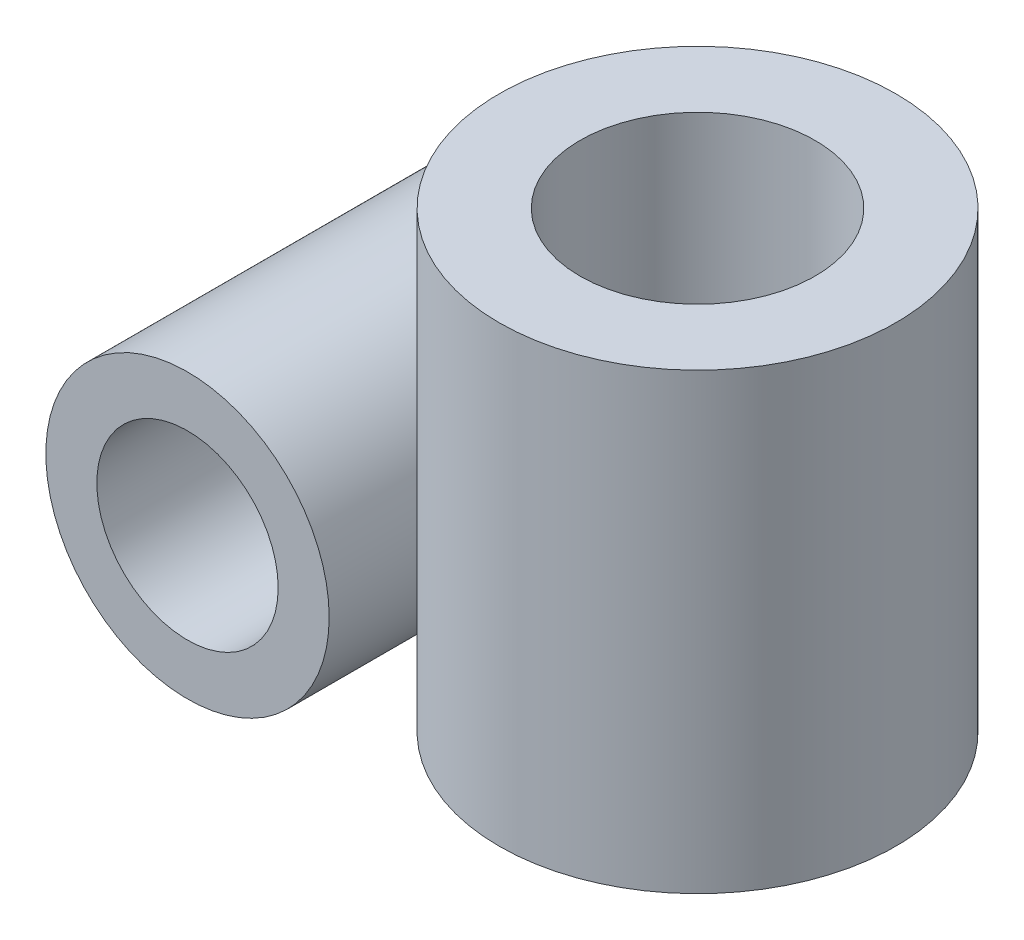
ISO-10303-21;
HEADER;
FILE_DESCRIPTION(('STEP AP214'),'2;1');
FILE_NAME('part.step','',(''),(''),'','','');
FILE_SCHEMA(('AUTOMOTIVE_DESIGN { 1 0 10303 214 1 1 1 1 }'));
ENDSEC;
DATA;
#1=APPLICATION_CONTEXT('core data for automotive mechanical design processes');
#2=APPLICATION_PROTOCOL_DEFINITION('international standard','automotive_design',2000,#1);
#3=PRODUCT_CONTEXT('',#1,'mechanical');
#4=PRODUCT('Part','Part','',(#3));
#5=PRODUCT_RELATED_PRODUCT_CATEGORY('part','',(#4));
#6=PRODUCT_DEFINITION_FORMATION('','',#4);
#7=PRODUCT_DEFINITION_CONTEXT('part definition',#1,'design');
#8=PRODUCT_DEFINITION('design','',#6,#7);
#9=PRODUCT_DEFINITION_SHAPE('','',#8);
#10=(LENGTH_UNIT() NAMED_UNIT(*) SI_UNIT(.MILLI.,.METRE.));
#11=(NAMED_UNIT(*) PLANE_ANGLE_UNIT() SI_UNIT($,.RADIAN.));
#12=(NAMED_UNIT(*) SI_UNIT($,.STERADIAN.) SOLID_ANGLE_UNIT());
#13=UNCERTAINTY_MEASURE_WITH_UNIT(LENGTH_MEASURE(1.E-05),#10,'distance_accuracy_value','');
#14=(GEOMETRIC_REPRESENTATION_CONTEXT(3) GLOBAL_UNCERTAINTY_ASSIGNED_CONTEXT((#13)) GLOBAL_UNIT_ASSIGNED_CONTEXT((#10,
#11,#12)) REPRESENTATION_CONTEXT('',''));
#15=CARTESIAN_POINT('',(0.,0.,0.));
#16=DIRECTION('',(0.,0.,1.));
#17=DIRECTION('',(1.,0.,0.));
#18=AXIS2_PLACEMENT_3D('',#15,#16,#17);
#19=CARTESIAN_POINT('',(0.,16.,0.));
#20=DIRECTION('',(0.,-1.,0.));
#21=DIRECTION('',(0.,0.,-1.));
#22=AXIS2_PLACEMENT_3D('',#19,#20,#21);
#23=CYLINDRICAL_SURFACE('',#22,7.);
#24=CARTESIAN_POINT('',(0.,0.,0.));
#25=DIRECTION('',(0.,1.,0.));
#26=DIRECTION('',(0.,0.,1.));
#27=AXIS2_PLACEMENT_3D('',#24,#25,#26);
#28=CIRCLE('',#27,7.);
#29=CARTESIAN_POINT('',(0.,0.,7.));
#30=VERTEX_POINT('',#29);
#31=EDGE_CURVE('E60',#30,#30,#28,.T.);
#32=ORIENTED_EDGE('',*,*,#31,.T.);
#33=EDGE_LOOP('',(#32));
#34=FACE_BOUND('',#33,.T.);
#35=CARTESIAN_POINT('',(0.,16.,0.));
#36=DIRECTION('',(0.,1.,0.));
#37=DIRECTION('',(0.,0.,1.));
#38=AXIS2_PLACEMENT_3D('',#35,#36,#37);
#39=CIRCLE('',#38,7.);
#40=CARTESIAN_POINT('',(0.,16.,7.));
#41=VERTEX_POINT('',#40);
#42=EDGE_CURVE('E55',#41,#41,#39,.T.);
#43=ORIENTED_EDGE('',*,*,#42,.F.);
#44=EDGE_LOOP('',(#43));
#45=FACE_BOUND('',#44,.T.);
#46=CARTESIAN_POINT('',(-7.,9.,0.));
#47=CARTESIAN_POINT('',(-7.00000021391944,8.99999958598632,-0.149513409221021));
#48=CARTESIAN_POINT('',(-6.99520473204957,8.99641683546412,-0.299022395938686));
#49=CARTESIAN_POINT('',(-6.97608420309327,8.98196914776317,-0.597127977276325));
#50=CARTESIAN_POINT('',(-6.96175620711012,8.97110195712475,-0.74572427519412));
#51=CARTESIAN_POINT('',(-6.92373154199772,8.94171928034641,-1.04123684317492));
#52=CARTESIAN_POINT('',(-6.90001761525997,8.92318970279629,-1.1881495026941));
#53=CARTESIAN_POINT('',(-6.84358438470612,8.87793099010202,-1.47894705862266));
#54=CARTESIAN_POINT('',(-6.81086591715694,8.85120261636751,-1.62283223486438));
#55=CARTESIAN_POINT('',(-6.73677250347208,8.78862919637888,-1.90725188021725));
#56=CARTESIAN_POINT('',(-6.69534970997811,8.75273351255337,-2.04776283504164));
#57=CARTESIAN_POINT('',(-6.60478129390443,8.67099570088918,-2.32333717281914));
#58=CARTESIAN_POINT('',(-6.55563485526222,8.62515252182606,-2.45839997823623));
#59=CARTESIAN_POINT('',(-6.45088906552741,8.52266479266894,-2.72140075078879));
#60=CARTESIAN_POINT('',(-6.39530372316844,8.466043525249,-2.84935332141885));
#61=CARTESIAN_POINT('',(-6.27913693932281,8.34102489054074,-3.09695258314991));
#62=CARTESIAN_POINT('',(-6.21855760144933,8.27263246852537,-3.21660273274605));
#63=CARTESIAN_POINT('',(-6.11148577380977,8.14394638248175,-3.41448358609433));
#64=CARTESIAN_POINT('',(-6.06571162128851,8.08661447078418,-3.49504224849227));
#65=CARTESIAN_POINT('',(-5.97343146216957,7.96522468402023,-3.65051817843769));
#66=CARTESIAN_POINT('',(-5.92692536054794,7.90116592942753,-3.72543470607865));
#67=CARTESIAN_POINT('',(-5.83417745444438,7.76633556404741,-3.86906729032247));
#68=CARTESIAN_POINT('',(-5.78793553333255,7.69556720507149,-3.93778631935276));
#69=CARTESIAN_POINT('',(-5.69672225955359,7.54742307715373,-4.06862582245995));
#70=CARTESIAN_POINT('',(-5.65175079047664,7.47004791621479,-4.13074690254696));
#71=CARTESIAN_POINT('',(-5.56391576027291,7.30860105764693,-4.24832368823793));
#72=CARTESIAN_POINT('',(-5.52106301301303,7.22449980028203,-4.30374694282575));
#73=CARTESIAN_POINT('',(-5.43874400366285,7.05041667002687,-4.40731672129346));
#74=CARTESIAN_POINT('',(-5.39927636063444,6.96043722176318,-4.45546621863175));
#75=CARTESIAN_POINT('',(-5.32465997712237,6.77515415504515,-4.54437763699179));
#76=CARTESIAN_POINT('',(-5.28951246432687,6.67984903429022,-4.58513745958269));
#77=CARTESIAN_POINT('',(-5.22440426398648,6.48467686432461,-4.6591880989371));
#78=CARTESIAN_POINT('',(-5.1944432485559,6.38481010400151,-4.69247938789396));
#79=CARTESIAN_POINT('',(-5.14254542908095,6.18934607288317,-4.7492723043781));
#80=CARTESIAN_POINT('',(-5.1201630416134,6.09403011845507,-4.77333769729802));
#81=CARTESIAN_POINT('',(-5.08084197856054,5.90088777096525,-4.81517087188187));
#82=CARTESIAN_POINT('',(-5.06390512761871,5.80306054828105,-4.83293654289397));
#83=CARTESIAN_POINT('',(-5.03582280846871,5.60570240672646,-4.86219087391803));
#84=CARTESIAN_POINT('',(-5.02467452757751,5.50617233960404,-4.87368258260649));
#85=CARTESIAN_POINT('',(-5.00836649357142,5.30606451929181,-4.89043990075769));
#86=CARTESIAN_POINT('',(-5.00320894876366,5.20548639354173,-4.89570321432076));
#87=CARTESIAN_POINT('',(-4.99903461366827,5.00634214335273,-4.89996540765377));
#88=CARTESIAN_POINT('',(-4.99988201392285,4.90778177460359,-4.89910283122148));
#89=CARTESIAN_POINT('',(-5.00738402333281,4.71107789587112,-4.89143476692845));
#90=CARTESIAN_POINT('',(-5.01404072879688,4.61293454921969,-4.88462713377199));
#91=CARTESIAN_POINT('',(-5.03303916582519,4.41784856156371,-4.8650490471986));
#92=CARTESIAN_POINT('',(-5.04537812912493,4.32090535946526,-4.85228149727387));
#93=CARTESIAN_POINT('',(-5.07551950738298,4.12882482759844,-4.82074445287699));
#94=CARTESIAN_POINT('',(-5.09332392308537,4.03368817271987,-4.80197276035612));
#95=CARTESIAN_POINT('',(-5.13403679166093,3.84604735888075,-4.75841911524174));
#96=CARTESIAN_POINT('',(-5.15693880546651,3.75354004344279,-4.73364474151241));
#97=CARTESIAN_POINT('',(-5.20743200954337,3.57164216616426,-4.67804042165514));
#98=CARTESIAN_POINT('',(-5.23502489324614,3.48225274399613,-4.64720828801226));
#99=CARTESIAN_POINT('',(-5.29434749497834,3.30726245673175,-4.57950928188211));
#100=CARTESIAN_POINT('',(-5.32607509249211,3.22165967956735,-4.54264550030627));
#101=CARTESIAN_POINT('',(-5.39305127723225,3.05471511464483,-4.46292665676198));
#102=CARTESIAN_POINT('',(-5.42830115525072,2.97337490573793,-4.42006939607812));
#103=CARTESIAN_POINT('',(-5.53905752094192,2.73486999155135,-4.28168801634631));
#104=CARTESIAN_POINT('',(-5.61898116804966,2.58490696810179,-4.17700012208154));
#105=CARTESIAN_POINT('',(-5.78407275545483,2.30700941828513,-3.94521393588894));
#106=CARTESIAN_POINT('',(-5.86924171409645,2.17907918786488,-3.81811128329473));
#107=CARTESIAN_POINT('',(-6.04367130531423,1.9388207924706,-3.53597543168701));
#108=CARTESIAN_POINT('',(-6.13287213114394,1.82788271525039,-3.37972667470665));
#109=CARTESIAN_POINT('',(-6.30386383066905,1.63017283654543,-3.04892781903278));
#110=CARTESIAN_POINT('',(-6.38565079957627,1.54341372049768,-2.87436817942778));
#111=CARTESIAN_POINT('',(-6.50444700437296,1.42441416257618,-2.58936694122428));
#112=CARTESIAN_POINT('',(-6.5455923239038,1.38476925294955,-2.48361696811128));
#113=CARTESIAN_POINT('',(-6.62331341026283,1.31207039465497,-2.26821654759696));
#114=CARTESIAN_POINT('',(-6.65988881867844,1.27901696282762,-2.15856579512757));
#115=CARTESIAN_POINT('',(-6.72795567135085,1.21902332354305,-1.9360184237874));
#116=CARTESIAN_POINT('',(-6.75944488344573,1.19208579806089,-1.82312040526724));
#117=CARTESIAN_POINT('',(-6.81694046133453,1.14389601553684,-1.59473871565956));
#118=CARTESIAN_POINT('',(-6.84294623552067,1.12264437187796,-1.47925476706154));
#119=CARTESIAN_POINT('',(-6.89316410785376,1.08224727364721,-1.22623756875762));
#120=CARTESIAN_POINT('',(-6.91629718770903,1.0640938015928,-1.08833021205597));
#121=CARTESIAN_POINT('',(-6.95431354212833,1.03460332011819,-0.810658461583644));
#122=CARTESIAN_POINT('',(-6.96919598486711,1.02326699799001,-0.670893882022687));
#123=CARTESIAN_POINT('',(-6.99053151961143,1.00709636154716,-0.390241364075654));
#124=CARTESIAN_POINT('',(-6.99697814605603,1.00226703438042,-0.249352647210242));
#125=CARTESIAN_POINT('',(-7.00134430012519,0.998991405844229,0.0326300298233025));
#126=CARTESIAN_POINT('',(-6.99926362930105,1.0005452530251,0.173723994691613));
#127=CARTESIAN_POINT('',(-6.98593856930246,1.01057439413396,0.469962899073776));
#128=CARTESIAN_POINT('',(-6.97376404358319,1.01975242068134,0.625043742963044));
#129=CARTESIAN_POINT('',(-6.93922597668089,1.04625050932803,0.933387742970569));
#130=CARTESIAN_POINT('',(-6.91686113220004,1.06357161290077,1.08665066401099));
#131=CARTESIAN_POINT('',(-6.86231661226025,1.10690921476272,1.39009331199207));
#132=CARTESIAN_POINT('',(-6.83014224108955,1.13292101447367,1.54027465850121));
#133=CARTESIAN_POINT('',(-6.75655453592855,1.19443004463379,1.83636134448062));
#134=CARTESIAN_POINT('',(-6.71514329365679,1.22992512792292,1.98226764359899));
#135=CARTESIAN_POINT('',(-6.63247876397469,1.30375030574399,2.24168396745431));
#136=CARTESIAN_POINT('',(-6.59264231033437,1.34031085259957,2.35615241139764));
#137=CARTESIAN_POINT('',(-6.50807994613448,1.42090702463805,2.58055462489425));
#138=CARTESIAN_POINT('',(-6.46335497015312,1.46494122190972,2.69048925569729));
#139=CARTESIAN_POINT('',(-6.36985165178029,1.56103033670469,2.90493814823118));
#140=CARTESIAN_POINT('',(-6.32107532831825,1.61308127012303,3.00945506812272));
#141=CARTESIAN_POINT('',(-6.22047087802563,1.72572761945416,3.21225038570256));
#142=CARTESIAN_POINT('',(-6.16864271354793,1.78632314078473,3.31052870640123));
#143=CARTESIAN_POINT('',(-6.06271025330398,1.91700124954368,3.50078581247958));
#144=CARTESIAN_POINT('',(-6.00859014464788,1.98716138005413,3.59270274030147));
#145=CARTESIAN_POINT('',(-5.89996118742299,2.13674651239127,3.76843882689473));
#146=CARTESIAN_POINT('',(-5.84545233141492,2.21617169196805,3.85225783025091));
#147=CARTESIAN_POINT('',(-5.73769841087016,2.38413863338046,4.01098697579087));
#148=CARTESIAN_POINT('',(-5.68445250297129,2.47267408793357,4.08590320519258));
#149=CARTESIAN_POINT('',(-5.58087154255559,2.65850305868706,4.22628508407773));
#150=CARTESIAN_POINT('',(-5.5305359529662,2.75579495044026,4.29175248061464));
#151=CARTESIAN_POINT('',(-5.44149495706469,2.94350229705938,4.40391684850677));
#152=CARTESIAN_POINT('',(-5.4021680378275,3.03282331644928,4.45195832280003));
#153=CARTESIAN_POINT('',(-5.32777044458637,3.21671545032493,4.54072871565381));
#154=CARTESIAN_POINT('',(-5.2926993540167,3.31128604965257,4.58145835009359));
#155=CARTESIAN_POINT('',(-5.22765871762547,3.50494434340636,4.65553607686156));
#156=CARTESIAN_POINT('',(-5.19768834884026,3.60403130587388,4.68888536021595));
#157=CARTESIAN_POINT('',(-5.14354947013924,3.8059275495308,4.74821167083302));
#158=CARTESIAN_POINT('',(-5.1193807348452,3.90873668594489,4.77418898448452));
#159=CARTESIAN_POINT('',(-5.07912660104014,4.10863447437217,4.81697646410584));
#160=CARTESIAN_POINT('',(-5.06254036167062,4.20549951455052,4.83436428153852));
#161=CARTESIAN_POINT('',(-5.0350332565154,4.40096119540883,4.8630068584892));
#162=CARTESIAN_POINT('',(-5.02411422193738,4.499558385161,4.87425963569003));
#163=CARTESIAN_POINT('',(-5.00815916554354,4.69768001874502,4.89065156173333));
#164=CARTESIAN_POINT('',(-5.00312012815687,4.79720396086743,4.89579384438263));
#165=CARTESIAN_POINT('',(-4.99900716657523,4.99654044443887,4.89999349413926));
#166=CARTESIAN_POINT('',(-4.99993543932375,5.09635307865418,4.89904862017977));
#167=CARTESIAN_POINT('',(-5.00769278939771,5.29416982817704,4.89111875618795));
#168=CARTESIAN_POINT('',(-5.01444292370078,5.39218029808853,4.8842145719886));
#169=CARTESIAN_POINT('',(-5.03361961960216,5.58707495925239,4.86444888137229));
#170=CARTESIAN_POINT('',(-5.04604823847927,5.68395872925225,4.85158521584954));
#171=CARTESIAN_POINT('',(-5.07634751481381,5.87582790606725,4.8198730100119));
#172=CARTESIAN_POINT('',(-5.09421550186643,5.97081422009027,4.80102740627788));
#173=CARTESIAN_POINT('',(-5.13506996506946,6.15830238419792,4.75730502343708));
#174=CARTESIAN_POINT('',(-5.15805831203997,6.2508033123215,4.73242603962537));
#175=CARTESIAN_POINT('',(-5.20871816949155,6.43266545842921,4.67660926593529));
#176=CARTESIAN_POINT('',(-5.23639077373784,6.52202593722589,4.64567006074091));
#177=CARTESIAN_POINT('',(-5.29588765288655,6.69701867436994,4.5777301336608));
#178=CARTESIAN_POINT('',(-5.32771342041602,6.78264957749717,4.5407272312826));
#179=CARTESIAN_POINT('',(-5.39486961546228,6.94957957932885,4.4607289311563));
#180=CARTESIAN_POINT('',(-5.43019840255491,7.03088067846969,4.41773633452871));
#181=CARTESIAN_POINT('',(-5.50367385976062,7.18875530777902,4.32585774120041));
#182=CARTESIAN_POINT('',(-5.54182156877492,7.26532707569433,4.27696956747364));
#183=CARTESIAN_POINT('',(-5.66079211923208,7.49003010186984,4.11980889951867));
#184=CARTESIAN_POINT('',(-5.74492542886505,7.63021537932185,4.00243639476319));
#185=CARTESIAN_POINT('',(-5.91519916737576,7.88761737501109,3.74620828653757));
#186=CARTESIAN_POINT('',(-6.0013400639656,8.00482867987186,3.60734763355745));
#187=CARTESIAN_POINT('',(-6.17631276753077,8.22501905223704,3.29952916467101));
#188=CARTESIAN_POINT('',(-6.26481706857472,8.32613481842015,3.12905845815878));
#189=CARTESIAN_POINT('',(-6.43121056055745,8.50409121883642,2.77101632645874));
#190=CARTESIAN_POINT('',(-6.50909079005266,8.58091143080354,2.58343068459787));
#191=CARTESIAN_POINT('',(-6.62023208408884,8.68513967474534,2.27746519649591));
#192=CARTESIAN_POINT('',(-6.65846773341587,8.71972979475039,2.16322514745384));
#193=CARTESIAN_POINT('',(-6.72940600611311,8.78225569670156,1.9312634337972));
#194=CARTESIAN_POINT('',(-6.76210946799848,8.81019248735688,1.813542299995));
#195=CARTESIAN_POINT('',(-6.82152778491658,8.85989806758009,1.57538068421222));
#196=CARTESIAN_POINT('',(-6.84824490644135,8.88166919236137,1.45494125048417));
#197=CARTESIAN_POINT('',(-6.89539056809781,8.91947834665749,1.2119828096135));
#198=CARTESIAN_POINT('',(-6.91582023520356,8.93551740368112,1.08946417930851));
#199=CARTESIAN_POINT('',(-6.95520835612675,8.96611258987444,0.806818560122147));
#200=CARTESIAN_POINT('',(-6.97198405885648,8.97885904957851,0.646184879580886));
#201=CARTESIAN_POINT('',(-6.99438000109007,8.99580315964034,0.323699106134435));
#202=CARTESIAN_POINT('',(-6.99999976843407,9.0000004481662,0.16184696195042));
#203=CARTESIAN_POINT('',(-7.,9.,0.));
#204=B_SPLINE_CURVE_WITH_KNOTS('',3,(#46,#47,#48,#49,#50,#51,#52,#53,#54,#55,#56,#57,#58,#59,
#60,#61,#62,#63,#64,#65,#66,#67,#68,#69,#70,#71,#72,#73,#74,#75,#76,#77,#78,#79,#80,#81,#82,#83,
#84,#85,#86,#87,#88,#89,#90,#91,#92,#93,#94,#95,#96,#97,#98,#99,#100,#101,#102,#103,#104,#105,
#106,#107,#108,#109,#110,#111,#112,#113,#114,#115,#116,#117,#118,#119,#120,#121,#122,#123,#124,
#125,#126,#127,#128,#129,#130,#131,#132,#133,#134,#135,#136,#137,#138,#139,#140,#141,#142,#143,
#144,#145,#146,#147,#148,#149,#150,#151,#152,#153,#154,#155,#156,#157,#158,#159,#160,#161,#162,
#163,#164,#165,#166,#167,#168,#169,#170,#171,#172,#173,#174,#175,#176,#177,#178,#179,#180,#181,
#182,#183,#184,#185,#186,#187,#188,#189,#190,#191,#192,#193,#194,#195,#196,#197,#198,#199,#200,
#201,#202,#203),.UNSPECIFIED.,.T.,.F.,(4,2,2,2,2,2,2,2,2,2,2,2,2,2,2,2,2,2,2,2,2,2,2,2,2,2,2,2,
2,2,2,2,2,2,2,2,2,2,2,2,2,2,2,2,2,2,2,2,2,2,2,2,2,2,2,2,2,2,2,2,2,2,2,2,2,2,2,2,2,2,2,2,2,2,2,2,
2,2,4),(0.,0.448412212679088,0.896963206849957,1.34634279738588,1.79568066735529,
2.24755635874757,2.6994798264191,3.1504379121598,3.60120700272921,3.92775937753703,
4.25435450194745,4.5807921432738,4.90719977589709,5.23513033220531,5.56292646802899,
5.89081554215125,6.21868387984687,6.52078390648487,6.82298505296122,7.12503922128269,
7.42720469761234,7.7225584870121,8.01801889998006,8.31333552350151,8.60876038307988,
8.90381417125794,9.19897470265378,9.49398445037195,9.78910270808131,10.384967280551,
10.9809479032929,11.6125604644692,12.2445037785743,12.6048121241023,12.9651487104631,
13.3256430093618,13.6861761820895,14.1087596962192,14.5313858072709,14.9543356472192,
15.3772953301833,15.8442241390961,16.3112126829596,16.7779491594249,17.2445800490575,
17.6240038943981,18.0033553286813,18.382518840109,18.7616870298279,19.1441356475402,
19.5265916037408,19.9087845347716,20.2909067089971,20.6168061058044,20.9426735774032,
21.2684884227555,21.5942906090071,21.8933360342579,22.1924780280829,22.4914665386884,
22.7905651321381,23.0856706663797,23.3808832003601,23.6759510357185,23.9711268570401,
24.2663716966723,24.5617229396348,24.856936520384,25.1522594487012,25.7531888189751,
26.354259616965,27.0029514173202,27.6521870522115,28.027892910721,28.4035417722692,
28.7790481679391,29.1544872179502,29.6398689860093,30.1252712967565),.UNSPECIFIED.);
#205=CARTESIAN_POINT('',(-7.,9.,0.));
#206=VERTEX_POINT('',#205);
#207=EDGE_CURVE('E10',#206,#206,#204,.T.);
#208=ORIENTED_EDGE('',*,*,#207,.F.);
#209=EDGE_LOOP('',(#208));
#210=FACE_BOUND('',#209,.T.);
#211=ADVANCED_FACE('F43',(#34,#45,#210),#23,.T.);
#212=CARTESIAN_POINT('',(0.,16.,0.));
#213=DIRECTION('',(0.,1.,0.));
#214=DIRECTION('',(0.,0.,1.));
#215=AXIS2_PLACEMENT_3D('',#212,#213,#214);
#216=PLANE('',#215);
#217=ORIENTED_EDGE('',*,*,#42,.T.);
#218=EDGE_LOOP('',(#217));
#219=FACE_BOUND('',#218,.T.);
#220=CARTESIAN_POINT('',(0.,16.,0.));
#221=DIRECTION('',(0.,1.,0.));
#222=DIRECTION('',(0.,0.,1.));
#223=AXIS2_PLACEMENT_3D('',#220,#221,#222);
#224=CIRCLE('',#223,4.15);
#225=CARTESIAN_POINT('',(0.,16.,4.15));
#226=VERTEX_POINT('',#225);
#227=EDGE_CURVE('E66',#226,#226,#224,.T.);
#228=ORIENTED_EDGE('',*,*,#227,.F.);
#229=EDGE_LOOP('',(#228));
#230=FACE_BOUND('',#229,.T.);
#231=ADVANCED_FACE('F110',(#219,#230),#216,.T.);
#232=CARTESIAN_POINT('',(0.,0.,0.));
#233=DIRECTION('',(0.,1.,0.));
#234=DIRECTION('',(0.,0.,1.));
#235=AXIS2_PLACEMENT_3D('',#232,#233,#234);
#236=PLANE('',#235);
#237=ORIENTED_EDGE('',*,*,#31,.F.);
#238=EDGE_LOOP('',(#237));
#239=FACE_BOUND('',#238,.T.);
#240=CARTESIAN_POINT('',(0.,0.,0.));
#241=DIRECTION('',(0.,1.,0.));
#242=DIRECTION('',(0.,0.,1.));
#243=AXIS2_PLACEMENT_3D('',#240,#241,#242);
#244=CIRCLE('',#243,4.15);
#245=CARTESIAN_POINT('',(0.,0.,4.15));
#246=VERTEX_POINT('',#245);
#247=EDGE_CURVE('E68',#246,#246,#244,.T.);
#248=ORIENTED_EDGE('',*,*,#247,.T.);
#249=EDGE_LOOP('',(#248));
#250=FACE_BOUND('',#249,.T.);
#251=ADVANCED_FACE('F116',(#239,#250),#236,.F.);
#252=CARTESIAN_POINT('',(0.,16.,0.));
#253=DIRECTION('',(0.,-1.,0.));
#254=DIRECTION('',(0.,0.,-1.));
#255=AXIS2_PLACEMENT_3D('',#252,#253,#254);
#256=CYLINDRICAL_SURFACE('',#255,4.15);
#257=ORIENTED_EDGE('',*,*,#227,.T.);
#258=EDGE_LOOP('',(#257));
#259=FACE_BOUND('',#258,.T.);
#260=ORIENTED_EDGE('',*,*,#247,.F.);
#261=EDGE_LOOP('',(#260));
#262=FACE_BOUND('',#261,.T.);
#263=ADVANCED_FACE('F124',(#259,#262),#256,.F.);
#264=CARTESIAN_POINT('',(-10.,5.,8.));
#265=DIRECTION('',(0.,0.,-1.));
#266=DIRECTION('',(-1.,0.,0.));
#267=AXIS2_PLACEMENT_3D('',#264,#265,#266);
#268=CYLINDRICAL_SURFACE('',#267,5.);
#269=CARTESIAN_POINT('',(-10.,5.,-8.));
#270=DIRECTION('',(0.,0.,1.));
#271=DIRECTION('',(1.,0.,0.));
#272=AXIS2_PLACEMENT_3D('',#269,#270,#271);
#273=CIRCLE('',#272,5.);
#274=CARTESIAN_POINT('',(-5.,5.,-8.));
#275=VERTEX_POINT('',#274);
#276=EDGE_CURVE('E76',#275,#275,#273,.T.);
#277=ORIENTED_EDGE('',*,*,#276,.T.);
#278=EDGE_LOOP('',(#277));
#279=FACE_BOUND('',#278,.T.);
#280=CARTESIAN_POINT('',(-10.,5.,8.));
#281=DIRECTION('',(0.,0.,1.));
#282=DIRECTION('',(1.,0.,0.));
#283=AXIS2_PLACEMENT_3D('',#280,#281,#282);
#284=CIRCLE('',#283,5.);
#285=CARTESIAN_POINT('',(-5.,5.,8.));
#286=VERTEX_POINT('',#285);
#287=EDGE_CURVE('E72',#286,#286,#284,.T.);
#288=ORIENTED_EDGE('',*,*,#287,.F.);
#289=EDGE_LOOP('',(#288));
#290=FACE_BOUND('',#289,.T.);
#291=ORIENTED_EDGE('',*,*,#207,.T.);
#292=EDGE_LOOP('',(#291));
#293=FACE_BOUND('',#292,.T.);
#294=ADVANCED_FACE('F107',(#279,#290,#293),#268,.T.);
#295=CARTESIAN_POINT('',(-10.,5.,8.));
#296=DIRECTION('',(0.,0.,-1.));
#297=DIRECTION('',(-1.,0.,0.));
#298=AXIS2_PLACEMENT_3D('',#295,#296,#297);
#299=CYLINDRICAL_SURFACE('',#298,3.2);
#300=CARTESIAN_POINT('',(-10.,5.,8.));
#301=DIRECTION('',(0.,0.,1.));
#302=DIRECTION('',(1.,0.,0.));
#303=AXIS2_PLACEMENT_3D('',#300,#301,#302);
#304=CIRCLE('',#303,3.2);
#305=CARTESIAN_POINT('',(-6.8,5.,8.));
#306=VERTEX_POINT('',#305);
#307=EDGE_CURVE('E80',#306,#306,#304,.T.);
#308=ORIENTED_EDGE('',*,*,#307,.T.);
#309=EDGE_LOOP('',(#308));
#310=FACE_BOUND('',#309,.T.);
#311=CARTESIAN_POINT('',(-10.,5.,-8.));
#312=DIRECTION('',(0.,0.,1.));
#313=DIRECTION('',(1.,0.,0.));
#314=AXIS2_PLACEMENT_3D('',#311,#312,#313);
#315=CIRCLE('',#314,3.2);
#316=CARTESIAN_POINT('',(-6.8,5.,-8.));
#317=VERTEX_POINT('',#316);
#318=EDGE_CURVE('E84',#317,#317,#315,.T.);
#319=ORIENTED_EDGE('',*,*,#318,.F.);
#320=EDGE_LOOP('',(#319));
#321=FACE_BOUND('',#320,.T.);
#322=ADVANCED_FACE('F92',(#310,#321),#299,.F.);
#323=CARTESIAN_POINT('',(-10.,5.,8.));
#324=DIRECTION('',(0.,0.,1.));
#325=DIRECTION('',(1.,0.,0.));
#326=AXIS2_PLACEMENT_3D('',#323,#324,#325);
#327=PLANE('',#326);
#328=ORIENTED_EDGE('',*,*,#287,.T.);
#329=EDGE_LOOP('',(#328));
#330=FACE_BOUND('',#329,.T.);
#331=ORIENTED_EDGE('',*,*,#307,.F.);
#332=EDGE_LOOP('',(#331));
#333=FACE_BOUND('',#332,.T.);
#334=ADVANCED_FACE('F95',(#330,#333),#327,.T.);
#335=CARTESIAN_POINT('',(-10.,5.,-8.));
#336=DIRECTION('',(0.,0.,1.));
#337=DIRECTION('',(1.,0.,0.));
#338=AXIS2_PLACEMENT_3D('',#335,#336,#337);
#339=PLANE('',#338);
#340=ORIENTED_EDGE('',*,*,#276,.F.);
#341=EDGE_LOOP('',(#340));
#342=FACE_BOUND('',#341,.T.);
#343=ORIENTED_EDGE('',*,*,#318,.T.);
#344=EDGE_LOOP('',(#343));
#345=FACE_BOUND('',#344,.T.);
#346=ADVANCED_FACE('F97',(#342,#345),#339,.F.);
#347=CLOSED_SHELL('',(#211,#231,#251,#263,#294,#322,#334,#346));
#348=MANIFOLD_SOLID_BREP('B2',#347);
#349=ADVANCED_BREP_SHAPE_REPRESENTATION('',(#18,#348),#14);
#350=SHAPE_DEFINITION_REPRESENTATION(#9,#349);
ENDSEC;
END-ISO-10303-21;
